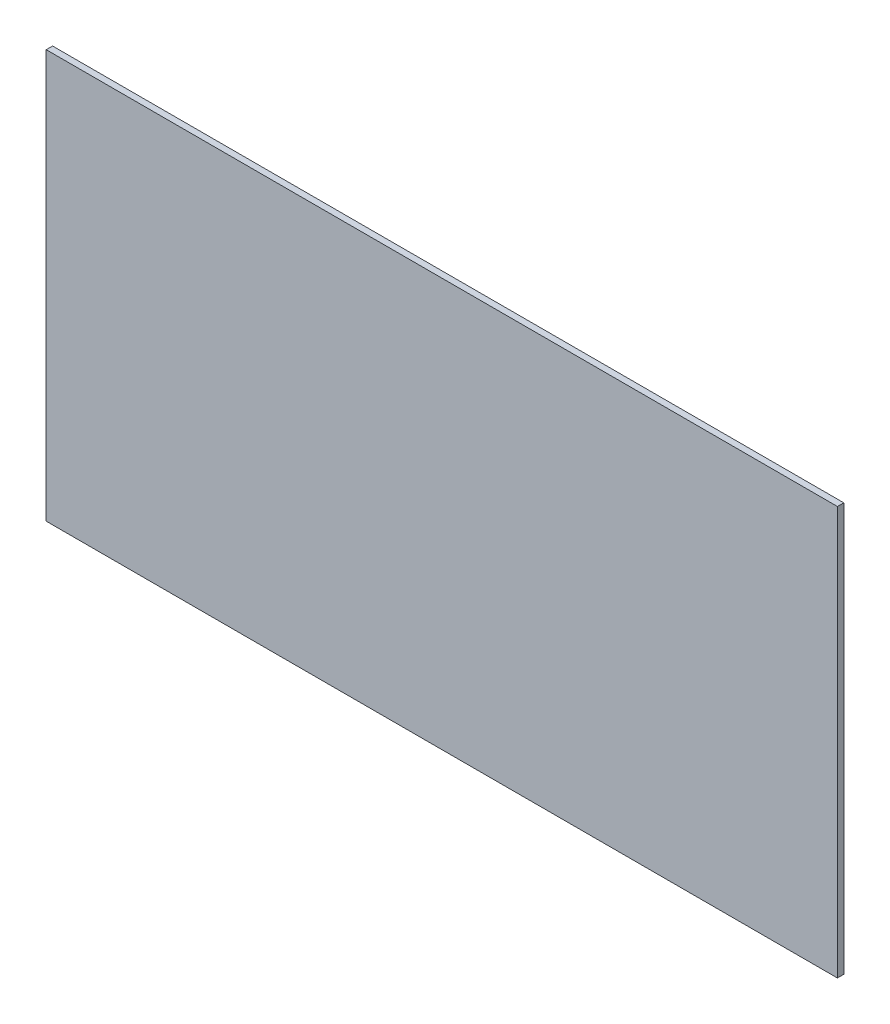
ISO-10303-21;
HEADER;
FILE_DESCRIPTION(('STEP AP214'),'2;1');
FILE_NAME('part.step','',(''),(''),'','','');
FILE_SCHEMA(('AUTOMOTIVE_DESIGN { 1 0 10303 214 1 1 1 1 }'));
ENDSEC;
DATA;
#1=APPLICATION_CONTEXT('core data for automotive mechanical design processes');
#2=APPLICATION_PROTOCOL_DEFINITION('international standard','automotive_design',2000,#1);
#3=PRODUCT_CONTEXT('',#1,'mechanical');
#4=PRODUCT('Part','Part','',(#3));
#5=PRODUCT_RELATED_PRODUCT_CATEGORY('part','',(#4));
#6=PRODUCT_DEFINITION_FORMATION('','',#4);
#7=PRODUCT_DEFINITION_CONTEXT('part definition',#1,'design');
#8=PRODUCT_DEFINITION('design','',#6,#7);
#9=PRODUCT_DEFINITION_SHAPE('','',#8);
#10=(LENGTH_UNIT() NAMED_UNIT(*) SI_UNIT(.MILLI.,.METRE.));
#11=(NAMED_UNIT(*) PLANE_ANGLE_UNIT() SI_UNIT($,.RADIAN.));
#12=(NAMED_UNIT(*) SI_UNIT($,.STERADIAN.) SOLID_ANGLE_UNIT());
#13=UNCERTAINTY_MEASURE_WITH_UNIT(LENGTH_MEASURE(1.E-05),#10,'distance_accuracy_value','');
#14=(GEOMETRIC_REPRESENTATION_CONTEXT(3) GLOBAL_UNCERTAINTY_ASSIGNED_CONTEXT((#13)) GLOBAL_UNIT_ASSIGNED_CONTEXT((#10,
#11,#12)) REPRESENTATION_CONTEXT('',''));
#15=CARTESIAN_POINT('',(0.,0.,0.));
#16=DIRECTION('',(0.,0.,1.));
#17=DIRECTION('',(1.,0.,0.));
#18=AXIS2_PLACEMENT_3D('',#15,#16,#17);
#19=CARTESIAN_POINT('',(-196.85,-101.6,1.5875));
#20=DIRECTION('',(0.,1.,0.));
#21=DIRECTION('',(0.,0.,1.));
#22=AXIS2_PLACEMENT_3D('',#19,#20,#21);
#23=PLANE('',#22);
#24=DIRECTION('',(1.,0.,0.));
#25=VECTOR('',#24,1.);
#26=CARTESIAN_POINT('',(-196.85,-101.6,-1.5875));
#27=LINE('',#26,#25);
#28=CARTESIAN_POINT('',(-196.85,-101.6,-1.5875));
#29=VERTEX_POINT('',#28);
#30=CARTESIAN_POINT('',(196.85,-101.6,-1.5875));
#31=VERTEX_POINT('',#30);
#32=EDGE_CURVE('E101',#29,#31,#27,.T.);
#33=ORIENTED_EDGE('',*,*,#32,.T.);
#34=DIRECTION('',(0.,0.,-1.));
#35=VECTOR('',#34,1.);
#36=CARTESIAN_POINT('',(196.85,-101.6,1.5875));
#37=LINE('',#36,#35);
#38=CARTESIAN_POINT('',(196.85,-101.6,1.5875));
#39=VERTEX_POINT('',#38);
#40=EDGE_CURVE('E11',#39,#31,#37,.T.);
#41=ORIENTED_EDGE('',*,*,#40,.F.);
#42=DIRECTION('',(1.,0.,0.));
#43=VECTOR('',#42,1.);
#44=CARTESIAN_POINT('',(-196.85,-101.6,1.5875));
#45=LINE('',#44,#43);
#46=CARTESIAN_POINT('',(-196.85,-101.6,1.5875));
#47=VERTEX_POINT('',#46);
#48=EDGE_CURVE('E89',#47,#39,#45,.T.);
#49=ORIENTED_EDGE('',*,*,#48,.F.);
#50=DIRECTION('',(0.,0.,-1.));
#51=VECTOR('',#50,1.);
#52=CARTESIAN_POINT('',(-196.85,-101.6,1.5875));
#53=LINE('',#52,#51);
#54=EDGE_CURVE('E97',#47,#29,#53,.T.);
#55=ORIENTED_EDGE('',*,*,#54,.T.);
#56=EDGE_LOOP('',(#33,#41,#49,#55));
#57=FACE_BOUND('',#56,.T.);
#58=ADVANCED_FACE('F38',(#57),#23,.F.);
#59=CARTESIAN_POINT('',(196.85,-101.6,1.5875));
#60=DIRECTION('',(-1.,0.,0.));
#61=DIRECTION('',(0.,0.,1.));
#62=AXIS2_PLACEMENT_3D('',#59,#60,#61);
#63=PLANE('',#62);
#64=DIRECTION('',(0.,1.,0.));
#65=VECTOR('',#64,1.);
#66=CARTESIAN_POINT('',(196.85,-101.6,-1.5875));
#67=LINE('',#66,#65);
#68=CARTESIAN_POINT('',(196.85,101.6,-1.5875));
#69=VERTEX_POINT('',#68);
#70=EDGE_CURVE('E93',#31,#69,#67,.T.);
#71=ORIENTED_EDGE('',*,*,#70,.T.);
#72=DIRECTION('',(0.,0.,-1.));
#73=VECTOR('',#72,1.);
#74=CARTESIAN_POINT('',(196.85,101.6,1.5875));
#75=LINE('',#74,#73);
#76=CARTESIAN_POINT('',(196.85,101.6,1.5875));
#77=VERTEX_POINT('',#76);
#78=EDGE_CURVE('E46',#77,#69,#75,.T.);
#79=ORIENTED_EDGE('',*,*,#78,.F.);
#80=DIRECTION('',(0.,1.,0.));
#81=VECTOR('',#80,1.);
#82=CARTESIAN_POINT('',(196.85,-101.6,1.5875));
#83=LINE('',#82,#81);
#84=EDGE_CURVE('E84',#39,#77,#83,.T.);
#85=ORIENTED_EDGE('',*,*,#84,.F.);
#86=ORIENTED_EDGE('',*,*,#40,.T.);
#87=EDGE_LOOP('',(#71,#79,#85,#86));
#88=FACE_BOUND('',#87,.T.);
#89=ADVANCED_FACE('F92',(#88),#63,.F.);
#90=CARTESIAN_POINT('',(-196.85,101.6,1.5875));
#91=DIRECTION('',(0.,-1.,0.));
#92=DIRECTION('',(0.,0.,-1.));
#93=AXIS2_PLACEMENT_3D('',#90,#91,#92);
#94=PLANE('',#93);
#95=DIRECTION('',(-1.,0.,0.));
#96=VECTOR('',#95,1.);
#97=CARTESIAN_POINT('',(-196.85,101.6,-1.5875));
#98=LINE('',#97,#96);
#99=CARTESIAN_POINT('',(-196.85,101.6,-1.5875));
#100=VERTEX_POINT('',#99);
#101=EDGE_CURVE('E71',#69,#100,#98,.T.);
#102=ORIENTED_EDGE('',*,*,#101,.T.);
#103=DIRECTION('',(0.,0.,-1.));
#104=VECTOR('',#103,1.);
#105=CARTESIAN_POINT('',(-196.85,101.6,1.5875));
#106=LINE('',#105,#104);
#107=CARTESIAN_POINT('',(-196.85,101.6,1.5875));
#108=VERTEX_POINT('',#107);
#109=EDGE_CURVE('E94',#108,#100,#106,.T.);
#110=ORIENTED_EDGE('',*,*,#109,.F.);
#111=DIRECTION('',(-1.,0.,0.));
#112=VECTOR('',#111,1.);
#113=CARTESIAN_POINT('',(-196.85,101.6,1.5875));
#114=LINE('',#113,#112);
#115=EDGE_CURVE('E87',#77,#108,#114,.T.);
#116=ORIENTED_EDGE('',*,*,#115,.F.);
#117=ORIENTED_EDGE('',*,*,#78,.T.);
#118=EDGE_LOOP('',(#102,#110,#116,#117));
#119=FACE_BOUND('',#118,.T.);
#120=ADVANCED_FACE('F95',(#119),#94,.F.);
#121=CARTESIAN_POINT('',(-196.85,-101.6,1.5875));
#122=DIRECTION('',(1.,0.,0.));
#123=DIRECTION('',(0.,0.,-1.));
#124=AXIS2_PLACEMENT_3D('',#121,#122,#123);
#125=PLANE('',#124);
#126=DIRECTION('',(0.,-1.,0.));
#127=VECTOR('',#126,1.);
#128=CARTESIAN_POINT('',(-196.85,-101.6,-1.5875));
#129=LINE('',#128,#127);
#130=EDGE_CURVE('E77',#100,#29,#129,.T.);
#131=ORIENTED_EDGE('',*,*,#130,.T.);
#132=ORIENTED_EDGE('',*,*,#54,.F.);
#133=DIRECTION('',(0.,-1.,0.));
#134=VECTOR('',#133,1.);
#135=CARTESIAN_POINT('',(-196.85,-101.6,1.5875));
#136=LINE('',#135,#134);
#137=EDGE_CURVE('E54',#108,#47,#136,.T.);
#138=ORIENTED_EDGE('',*,*,#137,.F.);
#139=ORIENTED_EDGE('',*,*,#109,.T.);
#140=EDGE_LOOP('',(#131,#132,#138,#139));
#141=FACE_BOUND('',#140,.T.);
#142=ADVANCED_FACE('F108',(#141),#125,.F.);
#143=CARTESIAN_POINT('',(0.,0.,1.5875));
#144=DIRECTION('',(0.,0.,1.));
#145=DIRECTION('',(1.,0.,0.));
#146=AXIS2_PLACEMENT_3D('',#143,#144,#145);
#147=PLANE('',#146);
#148=ORIENTED_EDGE('',*,*,#48,.T.);
#149=ORIENTED_EDGE('',*,*,#84,.T.);
#150=ORIENTED_EDGE('',*,*,#115,.T.);
#151=ORIENTED_EDGE('',*,*,#137,.T.);
#152=EDGE_LOOP('',(#148,#149,#150,#151));
#153=FACE_BOUND('',#152,.T.);
#154=ADVANCED_FACE('F85',(#153),#147,.T.);
#155=CARTESIAN_POINT('',(0.,0.,-1.5875));
#156=DIRECTION('',(0.,0.,1.));
#157=DIRECTION('',(1.,0.,0.));
#158=AXIS2_PLACEMENT_3D('',#155,#156,#157);
#159=PLANE('',#158);
#160=ORIENTED_EDGE('',*,*,#32,.F.);
#161=ORIENTED_EDGE('',*,*,#130,.F.);
#162=ORIENTED_EDGE('',*,*,#101,.F.);
#163=ORIENTED_EDGE('',*,*,#70,.F.);
#164=EDGE_LOOP('',(#160,#161,#162,#163));
#165=FACE_BOUND('',#164,.T.);
#166=ADVANCED_FACE('F111',(#165),#159,.F.);
#167=CLOSED_SHELL('',(#58,#89,#120,#142,#154,#166));
#168=MANIFOLD_SOLID_BREP('B2',#167);
#169=ADVANCED_BREP_SHAPE_REPRESENTATION('',(#18,#168),#14);
#170=SHAPE_DEFINITION_REPRESENTATION(#9,#169);
ENDSEC;
END-ISO-10303-21;
